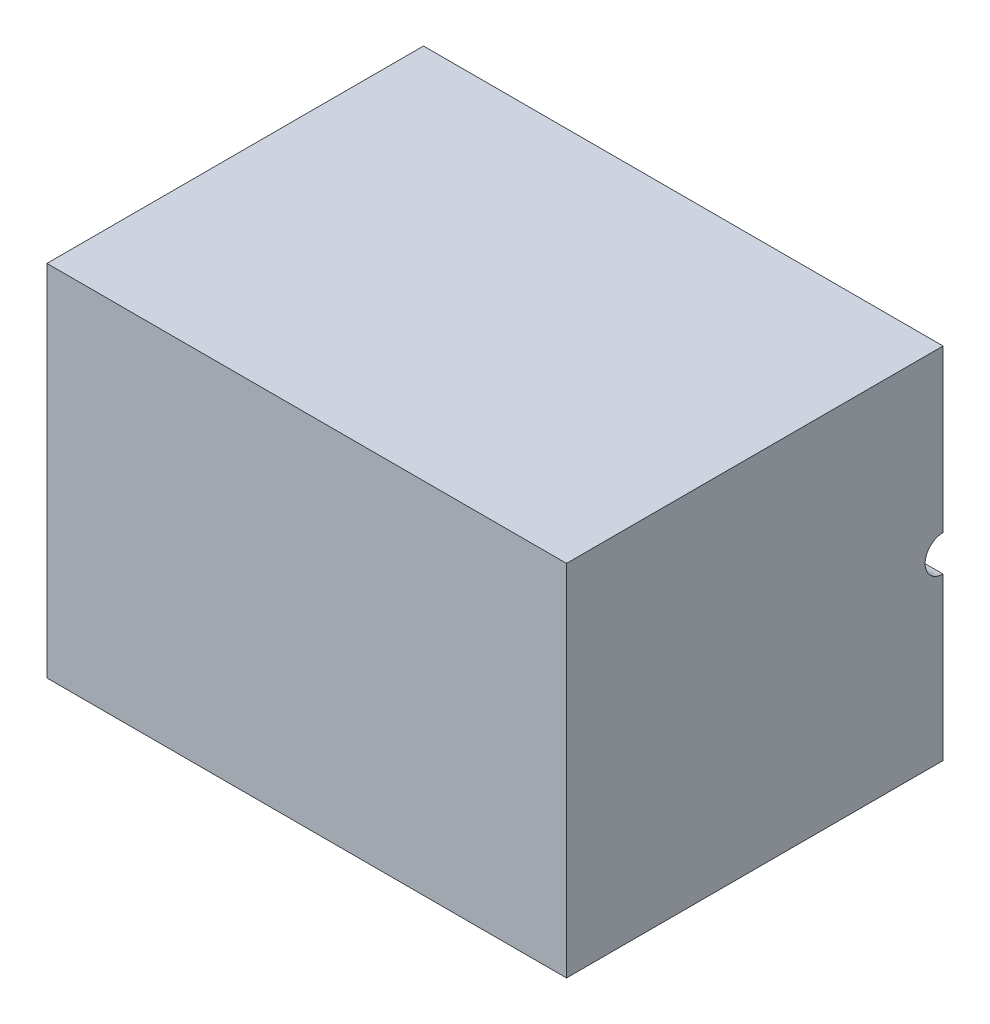
ISO-10303-21;
HEADER;
FILE_DESCRIPTION(('STEP AP214'),'2;1');
FILE_NAME('part.step','',(''),(''),'','','');
FILE_SCHEMA(('AUTOMOTIVE_DESIGN { 1 0 10303 214 1 1 1 1 }'));
ENDSEC;
DATA;
#1=APPLICATION_CONTEXT('core data for automotive mechanical design processes');
#2=APPLICATION_PROTOCOL_DEFINITION('international standard','automotive_design',2000,#1);
#3=PRODUCT_CONTEXT('',#1,'mechanical');
#4=PRODUCT('Part','Part','',(#3));
#5=PRODUCT_RELATED_PRODUCT_CATEGORY('part','',(#4));
#6=PRODUCT_DEFINITION_FORMATION('','',#4);
#7=PRODUCT_DEFINITION_CONTEXT('part definition',#1,'design');
#8=PRODUCT_DEFINITION('design','',#6,#7);
#9=PRODUCT_DEFINITION_SHAPE('','',#8);
#10=(LENGTH_UNIT() NAMED_UNIT(*) SI_UNIT(.MILLI.,.METRE.));
#11=(NAMED_UNIT(*) PLANE_ANGLE_UNIT() SI_UNIT($,.RADIAN.));
#12=(NAMED_UNIT(*) SI_UNIT($,.STERADIAN.) SOLID_ANGLE_UNIT());
#13=UNCERTAINTY_MEASURE_WITH_UNIT(LENGTH_MEASURE(1.E-05),#10,'distance_accuracy_value','');
#14=(GEOMETRIC_REPRESENTATION_CONTEXT(3) GLOBAL_UNCERTAINTY_ASSIGNED_CONTEXT((#13)) GLOBAL_UNIT_ASSIGNED_CONTEXT((#10,
#11,#12)) REPRESENTATION_CONTEXT('',''));
#15=CARTESIAN_POINT('',(0.,0.,0.));
#16=DIRECTION('',(0.,0.,1.));
#17=DIRECTION('',(1.,0.,0.));
#18=AXIS2_PLACEMENT_3D('',#15,#16,#17);
#19=CARTESIAN_POINT('',(72.3512585430906,100.,-52.4343390565094));
#20=DIRECTION('',(-1.,0.,0.));
#21=DIRECTION('',(0.,0.,1.));
#22=AXIS2_PLACEMENT_3D('',#19,#20,#21);
#23=PLANE('',#22);
#24=DIRECTION('',(0.,-1.,0.));
#25=VECTOR('',#24,1.);
#26=CARTESIAN_POINT('',(72.3512585430906,100.,-52.4343390565094));
#27=LINE('',#26,#25);
#28=CARTESIAN_POINT('',(72.3512585430906,45.,-52.4343390565094));
#29=VERTEX_POINT('',#28);
#30=CARTESIAN_POINT('',(72.3512585430906,0.,-52.4343390565094));
#31=VERTEX_POINT('',#30);
#32=EDGE_CURVE('E160',#29,#31,#27,.T.);
#33=ORIENTED_EDGE('',*,*,#32,.F.);
#34=CARTESIAN_POINT('',(72.3512585430906,50.,-52.4343390565094));
#35=DIRECTION('',(-1.,0.,0.));
#36=DIRECTION('',(0.,0.,1.));
#37=AXIS2_PLACEMENT_3D('',#34,#35,#36);
#38=CIRCLE('',#37,5.);
#39=CARTESIAN_POINT('',(72.3512585430906,55.,-52.4343390565094));
#40=VERTEX_POINT('',#39);
#41=EDGE_CURVE('E64',#29,#40,#38,.T.);
#42=ORIENTED_EDGE('',*,*,#41,.T.);
#43=CARTESIAN_POINT('',(72.3512585430906,100.,-52.4343390565094));
#44=VERTEX_POINT('',#43);
#45=EDGE_CURVE('E165',#44,#40,#27,.T.);
#46=ORIENTED_EDGE('',*,*,#45,.F.);
#47=DIRECTION('',(0.,0.,-1.));
#48=VECTOR('',#47,1.);
#49=CARTESIAN_POINT('',(72.3512585430906,100.,-52.4343390565094));
#50=LINE('',#49,#48);
#51=CARTESIAN_POINT('',(72.3512585430906,100.,52.4343390565094));
#52=VERTEX_POINT('',#51);
#53=EDGE_CURVE('E220',#52,#44,#50,.T.);
#54=ORIENTED_EDGE('',*,*,#53,.F.);
#55=DIRECTION('',(0.,-1.,0.));
#56=VECTOR('',#55,1.);
#57=CARTESIAN_POINT('',(72.3512585430906,100.,52.4343390565094));
#58=LINE('',#57,#56);
#59=CARTESIAN_POINT('',(72.3512585430906,0.,52.4343390565094));
#60=VERTEX_POINT('',#59);
#61=EDGE_CURVE('E229',#52,#60,#58,.T.);
#62=ORIENTED_EDGE('',*,*,#61,.T.);
#63=DIRECTION('',(0.,0.,-1.));
#64=VECTOR('',#63,1.);
#65=CARTESIAN_POINT('',(72.3512585430906,0.,-52.4343390565094));
#66=LINE('',#65,#64);
#67=EDGE_CURVE('E154',#60,#31,#66,.T.);
#68=ORIENTED_EDGE('',*,*,#67,.T.);
#69=EDGE_LOOP('',(#33,#42,#46,#54,#62,#68));
#70=FACE_BOUND('',#69,.T.);
#71=ADVANCED_FACE('F49',(#70),#23,.F.);
#72=CARTESIAN_POINT('',(-72.3512585430906,100.,-52.4343390565094));
#73=DIRECTION('',(0.,0.,1.));
#74=DIRECTION('',(1.,0.,0.));
#75=AXIS2_PLACEMENT_3D('',#72,#73,#74);
#76=PLANE('',#75);
#77=DIRECTION('',(-1.,0.,0.));
#78=VECTOR('',#77,1.);
#79=CARTESIAN_POINT('',(-17.6627581171341,55.,-52.4343390565094));
#80=LINE('',#79,#78);
#81=CARTESIAN_POINT('',(-72.3512585430906,55.,-52.4343390565094));
#82=VERTEX_POINT('',#81);
#83=CARTESIAN_POINT('',(-25.9480753988159,55.,-52.4343390565094));
#84=VERTEX_POINT('',#83);
#85=EDGE_CURVE('E138',#82,#84,#80,.F.);
#86=ORIENTED_EDGE('',*,*,#85,.F.);
#87=DIRECTION('',(0.,-1.,0.));
#88=VECTOR('',#87,1.);
#89=CARTESIAN_POINT('',(-72.3512585430906,100.,-52.4343390565094));
#90=LINE('',#89,#88);
#91=CARTESIAN_POINT('',(-72.3512585430906,100.,-52.4343390565094));
#92=VERTEX_POINT('',#91);
#93=EDGE_CURVE('E150',#92,#82,#90,.T.);
#94=ORIENTED_EDGE('',*,*,#93,.F.);
#95=DIRECTION('',(-1.,0.,0.));
#96=VECTOR('',#95,1.);
#97=CARTESIAN_POINT('',(-72.3512585430906,100.,-52.4343390565094));
#98=LINE('',#97,#96);
#99=EDGE_CURVE('E102',#44,#92,#98,.T.);
#100=ORIENTED_EDGE('',*,*,#99,.F.);
#101=ORIENTED_EDGE('',*,*,#45,.T.);
#102=DIRECTION('',(-1.,0.,0.));
#103=VECTOR('',#102,1.);
#104=CARTESIAN_POINT('',(76.3512585430906,55.,-52.4343390565094));
#105=LINE('',#104,#103);
#106=CARTESIAN_POINT('',(31.6972734855732,55.,-52.4343390565094));
#107=VERTEX_POINT('',#106);
#108=EDGE_CURVE('E184',#107,#40,#105,.F.);
#109=ORIENTED_EDGE('',*,*,#108,.F.);
#110=DIRECTION('',(-0.550157692952789,0.835060783946214,0.));
#111=VECTOR('',#110,1.);
#112=CARTESIAN_POINT('',(36.4941563973896,47.71901700885,-52.4343390565094));
#113=LINE('',#112,#111);
#114=CARTESIAN_POINT('',(18.5987817865307,74.8816391860472,-52.4343390565094));
#115=VERTEX_POINT('',#114);
#116=EDGE_CURVE('E187',#115,#107,#113,.F.);
#117=ORIENTED_EDGE('',*,*,#116,.F.);
#118=DIRECTION('',(-1.,0.,0.));
#119=VECTOR('',#118,1.);
#120=CARTESIAN_POINT('',(21.9309463117625,74.8816391860472,-52.4343390565094));
#121=LINE('',#120,#119);
#122=CARTESIAN_POINT('',(-11.6021082998645,74.8816391860472,-52.4343390565094));
#123=VERTEX_POINT('',#122);
#124=EDGE_CURVE('E57',#123,#115,#121,.F.);
#125=ORIENTED_EDGE('',*,*,#124,.F.);
#126=DIRECTION('',(-0.585142170169505,-0.810930724963188,0.));
#127=VECTOR('',#126,1.);
#128=CARTESIAN_POINT('',(-9.74750371369909,77.4518792375264,-52.4343390565094));
#129=LINE('',#128,#127);
#130=EDGE_CURVE('E12',#84,#123,#129,.F.);
#131=ORIENTED_EDGE('',*,*,#130,.F.);
#132=EDGE_LOOP('',(#86,#94,#100,#101,#109,#117,#125,#131));
#133=FACE_BOUND('',#132,.T.);
#134=ADVANCED_FACE('F149',(#133),#76,.F.);
#135=DIRECTION('',(-1.,0.,0.));
#136=VECTOR('',#135,1.);
#137=CARTESIAN_POINT('',(-17.6627581171341,45.,-52.4343390565094));
#138=LINE('',#137,#136);
#139=CARTESIAN_POINT('',(-20.8322520977648,45.,-52.4343390565094));
#140=VERTEX_POINT('',#139);
#141=CARTESIAN_POINT('',(-72.3512585430906,45.,-52.4343390565094));
#142=VERTEX_POINT('',#141);
#143=EDGE_CURVE('E141',#140,#142,#138,.T.);
#144=ORIENTED_EDGE('',*,*,#143,.F.);
#145=DIRECTION('',(-0.585142170169505,-0.810930724963188,0.));
#146=VECTOR('',#145,1.);
#147=CARTESIAN_POINT('',(-1.63819646406721,71.6004575358314,-52.4343390565094));
#148=LINE('',#147,#146);
#149=CARTESIAN_POINT('',(-6.4862849988134,64.8816391860472,-52.4343390565094));
#150=VERTEX_POINT('',#149);
#151=EDGE_CURVE('E181',#150,#140,#148,.T.);
#152=ORIENTED_EDGE('',*,*,#151,.F.);
#153=DIRECTION('',(-1.,0.,0.));
#154=VECTOR('',#153,1.);
#155=CARTESIAN_POINT('',(21.9309463117625,64.8816391860472,-52.4343390565094));
#156=LINE('',#155,#154);
#157=CARTESIAN_POINT('',(13.2118409111442,64.8816391860472,-52.4343390565094));
#158=VERTEX_POINT('',#157);
#159=EDGE_CURVE('E178',#158,#150,#156,.T.);
#160=ORIENTED_EDGE('',*,*,#159,.F.);
#161=DIRECTION('',(-0.550157692952789,0.835060783946214,0.));
#162=VECTOR('',#161,1.);
#163=CARTESIAN_POINT('',(28.1435485579275,42.2174400793221,-52.4343390565094));
#164=LINE('',#163,#162);
#165=CARTESIAN_POINT('',(26.3103326101868,45.,-52.4343390565094));
#166=VERTEX_POINT('',#165);
#167=EDGE_CURVE('E175',#166,#158,#164,.T.);
#168=ORIENTED_EDGE('',*,*,#167,.F.);
#169=DIRECTION('',(-1.,0.,0.));
#170=VECTOR('',#169,1.);
#171=CARTESIAN_POINT('',(76.3512585430906,45.,-52.4343390565094));
#172=LINE('',#171,#170);
#173=EDGE_CURVE('E172',#29,#166,#172,.T.);
#174=ORIENTED_EDGE('',*,*,#173,.F.);
#175=ORIENTED_EDGE('',*,*,#32,.T.);
#176=DIRECTION('',(-1.,0.,0.));
#177=VECTOR('',#176,1.);
#178=CARTESIAN_POINT('',(-72.3512585430906,0.,-52.4343390565094));
#179=LINE('',#178,#177);
#180=CARTESIAN_POINT('',(-72.3512585430906,0.,-52.4343390565094));
#181=VERTEX_POINT('',#180);
#182=EDGE_CURVE('E232',#31,#181,#179,.T.);
#183=ORIENTED_EDGE('',*,*,#182,.T.);
#184=EDGE_CURVE('E161',#142,#181,#90,.T.);
#185=ORIENTED_EDGE('',*,*,#184,.F.);
#186=EDGE_LOOP('',(#144,#152,#160,#168,#174,#175,#183,#185));
#187=FACE_BOUND('',#186,.T.);
#188=ADVANCED_FACE('F249',(#187),#76,.F.);
#189=CARTESIAN_POINT('',(-72.3512585430906,100.,-52.4343390565094));
#190=DIRECTION('',(1.,0.,0.));
#191=DIRECTION('',(0.,0.,-1.));
#192=AXIS2_PLACEMENT_3D('',#189,#190,#191);
#193=PLANE('',#192);
#194=ORIENTED_EDGE('',*,*,#93,.T.);
#195=CARTESIAN_POINT('',(-72.3512585430906,50.,-52.4343390565094));
#196=DIRECTION('',(1.,0.,0.));
#197=DIRECTION('',(0.,0.,-1.));
#198=AXIS2_PLACEMENT_3D('',#195,#196,#197);
#199=CIRCLE('',#198,5.);
#200=EDGE_CURVE('E134',#82,#142,#199,.T.);
#201=ORIENTED_EDGE('',*,*,#200,.T.);
#202=ORIENTED_EDGE('',*,*,#184,.T.);
#203=DIRECTION('',(0.,0.,1.));
#204=VECTOR('',#203,1.);
#205=CARTESIAN_POINT('',(-72.3512585430906,0.,-52.4343390565094));
#206=LINE('',#205,#204);
#207=CARTESIAN_POINT('',(-72.3512585430906,0.,52.4343390565094));
#208=VERTEX_POINT('',#207);
#209=EDGE_CURVE('E236',#181,#208,#206,.T.);
#210=ORIENTED_EDGE('',*,*,#209,.T.);
#211=DIRECTION('',(0.,-1.,0.));
#212=VECTOR('',#211,1.);
#213=CARTESIAN_POINT('',(-72.3512585430906,100.,52.4343390565094));
#214=LINE('',#213,#212);
#215=CARTESIAN_POINT('',(-72.3512585430906,100.,52.4343390565094));
#216=VERTEX_POINT('',#215);
#217=EDGE_CURVE('E167',#216,#208,#214,.T.);
#218=ORIENTED_EDGE('',*,*,#217,.F.);
#219=DIRECTION('',(0.,0.,1.));
#220=VECTOR('',#219,1.);
#221=CARTESIAN_POINT('',(-72.3512585430906,100.,-52.4343390565094));
#222=LINE('',#221,#220);
#223=EDGE_CURVE('E158',#92,#216,#222,.T.);
#224=ORIENTED_EDGE('',*,*,#223,.F.);
#225=EDGE_LOOP('',(#194,#201,#202,#210,#218,#224));
#226=FACE_BOUND('',#225,.T.);
#227=ADVANCED_FACE('F156',(#226),#193,.F.);
#228=CARTESIAN_POINT('',(-72.3512585430906,100.,52.4343390565094));
#229=DIRECTION('',(0.,0.,-1.));
#230=DIRECTION('',(-1.,0.,0.));
#231=AXIS2_PLACEMENT_3D('',#228,#229,#230);
#232=PLANE('',#231);
#233=DIRECTION('',(1.,0.,0.));
#234=VECTOR('',#233,1.);
#235=CARTESIAN_POINT('',(-72.3512585430906,0.,52.4343390565094));
#236=LINE('',#235,#234);
#237=EDGE_CURVE('E94',#208,#60,#236,.T.);
#238=ORIENTED_EDGE('',*,*,#237,.T.);
#239=ORIENTED_EDGE('',*,*,#61,.F.);
#240=DIRECTION('',(1.,0.,0.));
#241=VECTOR('',#240,1.);
#242=CARTESIAN_POINT('',(-72.3512585430906,100.,52.4343390565094));
#243=LINE('',#242,#241);
#244=EDGE_CURVE('E73',#216,#52,#243,.T.);
#245=ORIENTED_EDGE('',*,*,#244,.F.);
#246=ORIENTED_EDGE('',*,*,#217,.T.);
#247=EDGE_LOOP('',(#238,#239,#245,#246));
#248=FACE_BOUND('',#247,.T.);
#249=ADVANCED_FACE('F243',(#248),#232,.F.);
#250=CARTESIAN_POINT('',(0.,100.,0.));
#251=DIRECTION('',(0.,1.,0.));
#252=DIRECTION('',(0.,0.,1.));
#253=AXIS2_PLACEMENT_3D('',#250,#251,#252);
#254=PLANE('',#253);
#255=ORIENTED_EDGE('',*,*,#53,.T.);
#256=ORIENTED_EDGE('',*,*,#99,.T.);
#257=ORIENTED_EDGE('',*,*,#223,.T.);
#258=ORIENTED_EDGE('',*,*,#244,.T.);
#259=EDGE_LOOP('',(#255,#256,#257,#258));
#260=FACE_BOUND('',#259,.T.);
#261=ADVANCED_FACE('F266',(#260),#254,.T.);
#262=CARTESIAN_POINT('',(0.,0.,0.));
#263=DIRECTION('',(0.,1.,0.));
#264=DIRECTION('',(0.,0.,1.));
#265=AXIS2_PLACEMENT_3D('',#262,#263,#264);
#266=PLANE('',#265);
#267=ORIENTED_EDGE('',*,*,#67,.F.);
#268=ORIENTED_EDGE('',*,*,#237,.F.);
#269=ORIENTED_EDGE('',*,*,#209,.F.);
#270=ORIENTED_EDGE('',*,*,#182,.F.);
#271=EDGE_LOOP('',(#267,#268,#269,#270));
#272=FACE_BOUND('',#271,.T.);
#273=ADVANCED_FACE('F246',(#272),#266,.F.);
#274=CARTESIAN_POINT('',(-5.69285008888315,74.5261683866789,-52.4343390565094));
#275=DIRECTION('',(-0.585142170169505,-0.810930724963188,0.));
#276=DIRECTION('',(0.810930724963188,-0.585142170169505,0.));
#277=AXIS2_PLACEMENT_3D('',#274,#275,#276);
#278=CYLINDRICAL_SURFACE('',#277,5.);
#279=ORIENTED_EDGE('',*,*,#130,.T.);
#280=CARTESIAN_POINT('',(-9.04419664933895,69.8816391860472,-52.4343390565094));
#281=DIRECTION('',(-0.890264615204239,-0.455443646256315,0.));
#282=DIRECTION('',(-0.455443646256315,0.89026461520424,0.));
#283=AXIS2_PLACEMENT_3D('',#280,#281,#282);
#284=ELLIPSE('',#283,5.61630768493806,5.);
#285=EDGE_CURVE('E198',#150,#123,#284,.T.);
#286=ORIENTED_EDGE('',*,*,#285,.F.);
#287=ORIENTED_EDGE('',*,*,#151,.T.);
#288=CARTESIAN_POINT('',(-23.3901637482904,50.,-52.4343390565094));
#289=DIRECTION('',(-0.890264615204239,-0.455443646256315,0.));
#290=DIRECTION('',(0.455443646256315,-0.89026461520424,0.));
#291=AXIS2_PLACEMENT_3D('',#288,#289,#290);
#292=ELLIPSE('',#291,5.61630768493806,5.);
#293=EDGE_CURVE('E254',#140,#84,#292,.T.);
#294=ORIENTED_EDGE('',*,*,#293,.T.);
#295=EDGE_LOOP('',(#279,#286,#287,#294));
#296=FACE_BOUND('',#295,.T.);
#297=ADVANCED_FACE('F257',(#296),#278,.F.);
#298=CARTESIAN_POINT('',(21.9309463117625,69.8816391860472,-52.4343390565094));
#299=DIRECTION('',(-1.,0.,0.));
#300=DIRECTION('',(0.,0.,1.));
#301=AXIS2_PLACEMENT_3D('',#298,#299,#300);
#302=CYLINDRICAL_SURFACE('',#301,5.);
#303=ORIENTED_EDGE('',*,*,#124,.T.);
#304=CARTESIAN_POINT('',(15.9053113488374,69.8816391860472,-52.4343390565094));
#305=DIRECTION('',(-0.88038562373337,0.474258530259188,0.));
#306=DIRECTION('',(0.474258530259189,0.88038562373337,0.));
#307=AXIS2_PLACEMENT_3D('',#304,#305,#306);
#308=ELLIPSE('',#307,5.67932944974381,5.);
#309=EDGE_CURVE('E195',#158,#115,#308,.T.);
#310=ORIENTED_EDGE('',*,*,#309,.F.);
#311=ORIENTED_EDGE('',*,*,#159,.T.);
#312=ORIENTED_EDGE('',*,*,#285,.T.);
#313=EDGE_LOOP('',(#303,#310,#311,#312));
#314=FACE_BOUND('',#313,.T.);
#315=ADVANCED_FACE('F194',(#314),#302,.F.);
#316=CARTESIAN_POINT('',(32.3188524776586,44.968228544086,-52.4343390565094));
#317=DIRECTION('',(-0.550157692952789,0.835060783946214,0.));
#318=DIRECTION('',(-0.835060783946214,-0.550157692952789,0.));
#319=AXIS2_PLACEMENT_3D('',#316,#317,#318);
#320=CYLINDRICAL_SURFACE('',#319,5.);
#321=ORIENTED_EDGE('',*,*,#116,.T.);
#322=CARTESIAN_POINT('',(29.00380304788,50.,-52.4343390565094));
#323=DIRECTION('',(-0.88038562373337,0.474258530259188,0.));
#324=DIRECTION('',(-0.474258530259188,-0.88038562373337,0.));
#325=AXIS2_PLACEMENT_3D('',#322,#323,#324);
#326=ELLIPSE('',#325,5.67932944974381,5.);
#327=EDGE_CURVE('E146',#166,#107,#326,.T.);
#328=ORIENTED_EDGE('',*,*,#327,.F.);
#329=ORIENTED_EDGE('',*,*,#167,.T.);
#330=ORIENTED_EDGE('',*,*,#309,.T.);
#331=EDGE_LOOP('',(#321,#328,#329,#330));
#332=FACE_BOUND('',#331,.T.);
#333=ADVANCED_FACE('F201',(#332),#320,.F.);
#334=CARTESIAN_POINT('',(76.3512585430906,50.,-52.4343390565094));
#335=DIRECTION('',(-1.,0.,0.));
#336=DIRECTION('',(0.,0.,1.));
#337=AXIS2_PLACEMENT_3D('',#334,#335,#336);
#338=CYLINDRICAL_SURFACE('',#337,5.);
#339=ORIENTED_EDGE('',*,*,#108,.T.);
#340=ORIENTED_EDGE('',*,*,#41,.F.);
#341=ORIENTED_EDGE('',*,*,#173,.T.);
#342=ORIENTED_EDGE('',*,*,#327,.T.);
#343=EDGE_LOOP('',(#339,#340,#341,#342));
#344=FACE_BOUND('',#343,.T.);
#345=ADVANCED_FACE('F209',(#344),#338,.F.);
#346=CARTESIAN_POINT('',(-17.6627581171341,50.,-52.4343390565094));
#347=DIRECTION('',(-1.,0.,0.));
#348=DIRECTION('',(0.,0.,1.));
#349=AXIS2_PLACEMENT_3D('',#346,#347,#348);
#350=CYLINDRICAL_SURFACE('',#349,5.);
#351=ORIENTED_EDGE('',*,*,#85,.T.);
#352=ORIENTED_EDGE('',*,*,#293,.F.);
#353=ORIENTED_EDGE('',*,*,#143,.T.);
#354=ORIENTED_EDGE('',*,*,#200,.F.);
#355=EDGE_LOOP('',(#351,#352,#353,#354));
#356=FACE_BOUND('',#355,.T.);
#357=ADVANCED_FACE('F136',(#356),#350,.F.);
#358=CLOSED_SHELL('',(#71,#134,#188,#227,#249,#261,#273,#297,#315,#333,#345,#357));
#359=MANIFOLD_SOLID_BREP('B2',#358);
#360=ADVANCED_BREP_SHAPE_REPRESENTATION('',(#18,#359),#14);
#361=SHAPE_DEFINITION_REPRESENTATION(#9,#360);
ENDSEC;
END-ISO-10303-21;
